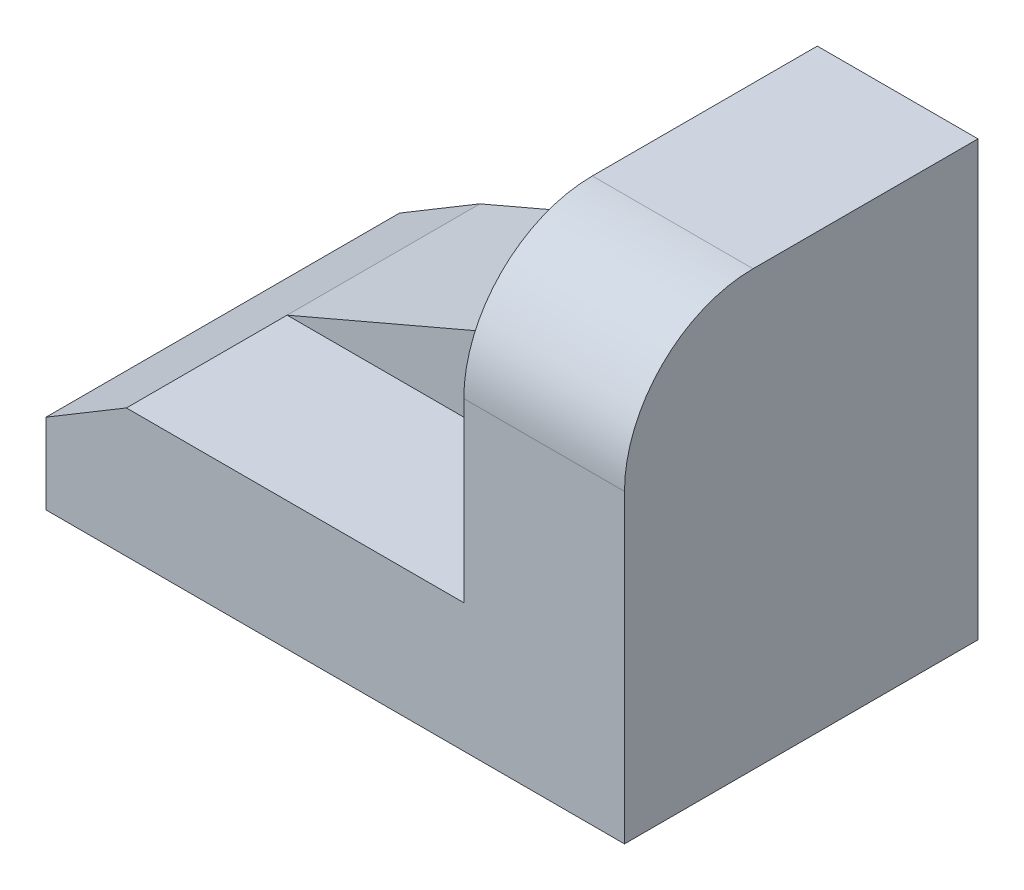
ISO-10303-21;
HEADER;
FILE_DESCRIPTION(('STEP AP214'),'2;1');
FILE_NAME('part.step','',(''),(''),'','','');
FILE_SCHEMA(('AUTOMOTIVE_DESIGN { 1 0 10303 214 1 1 1 1 }'));
ENDSEC;
DATA;
#1=APPLICATION_CONTEXT('core data for automotive mechanical design processes');
#2=APPLICATION_PROTOCOL_DEFINITION('international standard','automotive_design',2000,#1);
#3=PRODUCT_CONTEXT('',#1,'mechanical');
#4=PRODUCT('Part','Part','',(#3));
#5=PRODUCT_RELATED_PRODUCT_CATEGORY('part','',(#4));
#6=PRODUCT_DEFINITION_FORMATION('','',#4);
#7=PRODUCT_DEFINITION_CONTEXT('part definition',#1,'design');
#8=PRODUCT_DEFINITION('design','',#6,#7);
#9=PRODUCT_DEFINITION_SHAPE('','',#8);
#10=(LENGTH_UNIT() NAMED_UNIT(*) SI_UNIT(.MILLI.,.METRE.));
#11=(NAMED_UNIT(*) PLANE_ANGLE_UNIT() SI_UNIT($,.RADIAN.));
#12=(NAMED_UNIT(*) SI_UNIT($,.STERADIAN.) SOLID_ANGLE_UNIT());
#13=UNCERTAINTY_MEASURE_WITH_UNIT(LENGTH_MEASURE(1.E-05),#10,'distance_accuracy_value','');
#14=(GEOMETRIC_REPRESENTATION_CONTEXT(3) GLOBAL_UNCERTAINTY_ASSIGNED_CONTEXT((#13)) GLOBAL_UNIT_ASSIGNED_CONTEXT((#10,
#11,#12)) REPRESENTATION_CONTEXT('',''));
#15=CARTESIAN_POINT('',(0.,0.,0.));
#16=DIRECTION('',(0.,0.,1.));
#17=DIRECTION('',(1.,0.,0.));
#18=AXIS2_PLACEMENT_3D('',#15,#16,#17);
#19=CARTESIAN_POINT('',(5004.22818467735,8000.,22000.));
#20=DIRECTION('',(0.,-1.,0.));
#21=DIRECTION('',(0.,0.,-1.));
#22=AXIS2_PLACEMENT_3D('',#19,#20,#21);
#23=PLANE('',#22);
#24=DIRECTION('',(-1.,0.,0.));
#25=VECTOR('',#24,1.);
#26=CARTESIAN_POINT('',(5004.22818467735,8000.,12000.));
#27=LINE('',#26,#25);
#28=CARTESIAN_POINT('',(26000.,8000.,12000.));
#29=VERTEX_POINT('',#28);
#30=CARTESIAN_POINT('',(5004.22818467735,8000.,12000.));
#31=VERTEX_POINT('',#30);
#32=EDGE_CURVE('E176',#29,#31,#27,.T.);
#33=ORIENTED_EDGE('',*,*,#32,.T.);
#34=DIRECTION('',(0.,0.,-1.));
#35=VECTOR('',#34,1.);
#36=CARTESIAN_POINT('',(5004.22818467735,8000.,22000.));
#37=LINE('',#36,#35);
#38=CARTESIAN_POINT('',(5004.22818467735,8000.,22000.));
#39=VERTEX_POINT('',#38);
#40=EDGE_CURVE('E170',#39,#31,#37,.T.);
#41=ORIENTED_EDGE('',*,*,#40,.F.);
#42=DIRECTION('',(-1.,0.,0.));
#43=VECTOR('',#42,1.);
#44=CARTESIAN_POINT('',(5004.22818467735,8000.,22000.));
#45=LINE('',#44,#43);
#46=CARTESIAN_POINT('',(26000.,8000.,22000.));
#47=VERTEX_POINT('',#46);
#48=EDGE_CURVE('E177',#47,#39,#45,.T.);
#49=ORIENTED_EDGE('',*,*,#48,.F.);
#50=DIRECTION('',(0.,0.,-1.));
#51=VECTOR('',#50,1.);
#52=CARTESIAN_POINT('',(26000.,8000.,22000.));
#53=LINE('',#52,#51);
#54=EDGE_CURVE('E133',#47,#29,#53,.T.);
#55=ORIENTED_EDGE('',*,*,#54,.T.);
#56=EDGE_LOOP('',(#33,#41,#49,#55));
#57=FACE_BOUND('',#56,.T.);
#58=ADVANCED_FACE('F33',(#57),#23,.F.);
#59=CARTESIAN_POINT('',(36000.,27000.,22000.));
#60=DIRECTION('',(0.,-1.,0.));
#61=DIRECTION('',(0.,0.,-1.));
#62=AXIS2_PLACEMENT_3D('',#59,#60,#61);
#63=PLANE('',#62);
#64=DIRECTION('',(1.,0.,0.));
#65=VECTOR('',#64,1.);
#66=CARTESIAN_POINT('',(14000.,27000.,13999.9999999999));
#67=LINE('',#66,#65);
#68=CARTESIAN_POINT('',(26000.,27000.,13999.9999999999));
#69=VERTEX_POINT('',#68);
#70=CARTESIAN_POINT('',(36000.,27000.,13999.9999999999));
#71=VERTEX_POINT('',#70);
#72=EDGE_CURVE('E108',#69,#71,#67,.T.);
#73=ORIENTED_EDGE('',*,*,#72,.T.);
#74=DIRECTION('',(0.,0.,-1.));
#75=VECTOR('',#74,1.);
#76=CARTESIAN_POINT('',(36000.,27000.,22000.));
#77=LINE('',#76,#75);
#78=CARTESIAN_POINT('',(36000.,27000.,0.));
#79=VERTEX_POINT('',#78);
#80=EDGE_CURVE('E120',#71,#79,#77,.T.);
#81=ORIENTED_EDGE('',*,*,#80,.T.);
#82=DIRECTION('',(-1.,0.,0.));
#83=VECTOR('',#82,1.);
#84=CARTESIAN_POINT('',(36000.,27000.,0.));
#85=LINE('',#84,#83);
#86=CARTESIAN_POINT('',(26000.,27000.,0.));
#87=VERTEX_POINT('',#86);
#88=EDGE_CURVE('E162',#79,#87,#85,.T.);
#89=ORIENTED_EDGE('',*,*,#88,.T.);
#90=DIRECTION('',(0.,0.,-1.));
#91=VECTOR('',#90,1.);
#92=CARTESIAN_POINT('',(26000.,27000.,22000.));
#93=LINE('',#92,#91);
#94=EDGE_CURVE('E122',#69,#87,#93,.T.);
#95=ORIENTED_EDGE('',*,*,#94,.F.);
#96=EDGE_LOOP('',(#73,#81,#89,#95));
#97=FACE_BOUND('',#96,.T.);
#98=ADVANCED_FACE('F118',(#97),#63,.F.);
#99=CARTESIAN_POINT('',(0.,0.,22000.));
#100=DIRECTION('',(1.,0.,0.));
#101=DIRECTION('',(0.,0.,-1.));
#102=AXIS2_PLACEMENT_3D('',#99,#100,#101);
#103=PLANE('',#102);
#104=DIRECTION('',(0.,-1.,0.));
#105=VECTOR('',#104,1.);
#106=CARTESIAN_POINT('',(0.,0.,0.));
#107=LINE('',#106,#105);
#108=CARTESIAN_POINT('',(0.,5000.,0.));
#109=VERTEX_POINT('',#108);
#110=CARTESIAN_POINT('',(0.,0.,0.));
#111=VERTEX_POINT('',#110);
#112=EDGE_CURVE('E149',#109,#111,#107,.T.);
#113=ORIENTED_EDGE('',*,*,#112,.T.);
#114=DIRECTION('',(0.,0.,-1.));
#115=VECTOR('',#114,1.);
#116=CARTESIAN_POINT('',(0.,0.,22000.));
#117=LINE('',#116,#115);
#118=CARTESIAN_POINT('',(0.,0.,22000.));
#119=VERTEX_POINT('',#118);
#120=EDGE_CURVE('E41',#119,#111,#117,.T.);
#121=ORIENTED_EDGE('',*,*,#120,.F.);
#122=DIRECTION('',(0.,-1.,0.));
#123=VECTOR('',#122,1.);
#124=CARTESIAN_POINT('',(0.,0.,22000.));
#125=LINE('',#124,#123);
#126=CARTESIAN_POINT('',(0.,5000.,22000.));
#127=VERTEX_POINT('',#126);
#128=EDGE_CURVE('E168',#127,#119,#125,.T.);
#129=ORIENTED_EDGE('',*,*,#128,.F.);
#130=DIRECTION('',(0.,0.,-1.));
#131=VECTOR('',#130,1.);
#132=CARTESIAN_POINT('',(0.,5000.,22000.));
#133=LINE('',#132,#131);
#134=EDGE_CURVE('E151',#127,#109,#133,.T.);
#135=ORIENTED_EDGE('',*,*,#134,.T.);
#136=EDGE_LOOP('',(#113,#121,#129,#135));
#137=FACE_BOUND('',#136,.T.);
#138=ADVANCED_FACE('F35',(#137),#103,.F.);
#139=CARTESIAN_POINT('',(0.,0.,22000.));
#140=DIRECTION('',(0.,1.,0.));
#141=DIRECTION('',(0.,0.,1.));
#142=AXIS2_PLACEMENT_3D('',#139,#140,#141);
#143=PLANE('',#142);
#144=DIRECTION('',(1.,0.,0.));
#145=VECTOR('',#144,1.);
#146=CARTESIAN_POINT('',(0.,0.,0.));
#147=LINE('',#146,#145);
#148=CARTESIAN_POINT('',(36000.,0.,0.));
#149=VERTEX_POINT('',#148);
#150=EDGE_CURVE('E142',#111,#149,#147,.T.);
#151=ORIENTED_EDGE('',*,*,#150,.T.);
#152=DIRECTION('',(0.,0.,-1.));
#153=VECTOR('',#152,1.);
#154=CARTESIAN_POINT('',(36000.,0.,22000.));
#155=LINE('',#154,#153);
#156=CARTESIAN_POINT('',(36000.,0.,22000.));
#157=VERTEX_POINT('',#156);
#158=EDGE_CURVE('E130',#157,#149,#155,.T.);
#159=ORIENTED_EDGE('',*,*,#158,.F.);
#160=DIRECTION('',(1.,0.,0.));
#161=VECTOR('',#160,1.);
#162=CARTESIAN_POINT('',(0.,0.,22000.));
#163=LINE('',#162,#161);
#164=EDGE_CURVE('E143',#119,#157,#163,.T.);
#165=ORIENTED_EDGE('',*,*,#164,.F.);
#166=ORIENTED_EDGE('',*,*,#120,.T.);
#167=EDGE_LOOP('',(#151,#159,#165,#166));
#168=FACE_BOUND('',#167,.T.);
#169=ADVANCED_FACE('F140',(#168),#143,.F.);
#170=CARTESIAN_POINT('',(36000.,0.,22000.));
#171=DIRECTION('',(-1.,0.,0.));
#172=DIRECTION('',(0.,0.,1.));
#173=AXIS2_PLACEMENT_3D('',#170,#171,#172);
#174=PLANE('',#173);
#175=ORIENTED_EDGE('',*,*,#80,.F.);
#176=CARTESIAN_POINT('',(36000.,19000.,14000.));
#177=DIRECTION('',(-1.,0.,0.));
#178=DIRECTION('',(0.,0.,1.));
#179=AXIS2_PLACEMENT_3D('',#176,#177,#178);
#180=CIRCLE('',#179,8000.);
#181=CARTESIAN_POINT('',(36000.,18999.9999999999,22000.));
#182=VERTEX_POINT('',#181);
#183=EDGE_CURVE('E105',#182,#71,#180,.T.);
#184=ORIENTED_EDGE('',*,*,#183,.F.);
#185=DIRECTION('',(0.,1.,0.));
#186=VECTOR('',#185,1.);
#187=CARTESIAN_POINT('',(36000.,0.,22000.));
#188=LINE('',#187,#186);
#189=EDGE_CURVE('E195',#157,#182,#188,.T.);
#190=ORIENTED_EDGE('',*,*,#189,.F.);
#191=ORIENTED_EDGE('',*,*,#158,.T.);
#192=DIRECTION('',(0.,1.,0.));
#193=VECTOR('',#192,1.);
#194=CARTESIAN_POINT('',(36000.,0.,0.));
#195=LINE('',#194,#193);
#196=EDGE_CURVE('E128',#149,#79,#195,.T.);
#197=ORIENTED_EDGE('',*,*,#196,.T.);
#198=EDGE_LOOP('',(#175,#184,#190,#191,#197));
#199=FACE_BOUND('',#198,.T.);
#200=ADVANCED_FACE('F125',(#199),#174,.F.);
#201=CARTESIAN_POINT('',(26000.,27000.,22000.));
#202=DIRECTION('',(1.,0.,0.));
#203=DIRECTION('',(0.,1.,0.));
#204=AXIS2_PLACEMENT_3D('',#201,#202,#203);
#205=PLANE('',#204);
#206=DIRECTION('',(0.,-1.,0.));
#207=VECTOR('',#206,1.);
#208=CARTESIAN_POINT('',(26000.,27000.,0.));
#209=LINE('',#208,#207);
#210=CARTESIAN_POINT('',(26000.,17000.,0.));
#211=VERTEX_POINT('',#210);
#212=EDGE_CURVE('E164',#87,#211,#209,.T.);
#213=ORIENTED_EDGE('',*,*,#212,.T.);
#214=DIRECTION('',(0.,0.,-1.));
#215=VECTOR('',#214,1.);
#216=CARTESIAN_POINT('',(26000.,17000.,12000.));
#217=LINE('',#216,#215);
#218=CARTESIAN_POINT('',(26000.,17000.,12000.));
#219=VERTEX_POINT('',#218);
#220=EDGE_CURVE('E48',#219,#211,#217,.T.);
#221=ORIENTED_EDGE('',*,*,#220,.F.);
#222=DIRECTION('',(0.,-1.,0.));
#223=VECTOR('',#222,1.);
#224=CARTESIAN_POINT('',(26000.,8000.,12000.));
#225=LINE('',#224,#223);
#226=EDGE_CURVE('E52',#219,#29,#225,.T.);
#227=ORIENTED_EDGE('',*,*,#226,.T.);
#228=ORIENTED_EDGE('',*,*,#54,.F.);
#229=DIRECTION('',(0.,-1.,0.));
#230=VECTOR('',#229,1.);
#231=CARTESIAN_POINT('',(26000.,27000.,22000.));
#232=LINE('',#231,#230);
#233=CARTESIAN_POINT('',(26000.,19000.,22000.));
#234=VERTEX_POINT('',#233);
#235=EDGE_CURVE('E197',#234,#47,#232,.T.);
#236=ORIENTED_EDGE('',*,*,#235,.F.);
#237=CARTESIAN_POINT('',(26000.,19000.,14000.));
#238=DIRECTION('',(1.,0.,0.));
#239=DIRECTION('',(0.,1.,0.));
#240=AXIS2_PLACEMENT_3D('',#237,#238,#239);
#241=CIRCLE('',#240,8000.);
#242=EDGE_CURVE('E123',#234,#69,#241,.F.);
#243=ORIENTED_EDGE('',*,*,#242,.T.);
#244=ORIENTED_EDGE('',*,*,#94,.T.);
#245=EDGE_LOOP('',(#213,#221,#227,#228,#236,#243,#244));
#246=FACE_BOUND('',#245,.T.);
#247=ADVANCED_FACE('F226',(#246),#205,.F.);
#248=CARTESIAN_POINT('',(0.,5000.,22000.));
#249=DIRECTION('',(0.514176009207606,-0.857684692387208,0.));
#250=DIRECTION('',(0.857684692387208,0.514176009207606,0.));
#251=AXIS2_PLACEMENT_3D('',#248,#249,#250);
#252=PLANE('',#251);
#253=DIRECTION('',(-0.857684692387208,-0.514176009207606,0.));
#254=VECTOR('',#253,1.);
#255=CARTESIAN_POINT('',(0.,5000.,0.));
#256=LINE('',#255,#254);
#257=CARTESIAN_POINT('',(5004.22818467735,8000.,0.));
#258=VERTEX_POINT('',#257);
#259=EDGE_CURVE('E166',#258,#109,#256,.T.);
#260=ORIENTED_EDGE('',*,*,#259,.T.);
#261=ORIENTED_EDGE('',*,*,#134,.F.);
#262=DIRECTION('',(-0.857684692387208,-0.514176009207606,0.));
#263=VECTOR('',#262,1.);
#264=CARTESIAN_POINT('',(0.,5000.,22000.));
#265=LINE('',#264,#263);
#266=EDGE_CURVE('E158',#39,#127,#265,.T.);
#267=ORIENTED_EDGE('',*,*,#266,.F.);
#268=ORIENTED_EDGE('',*,*,#40,.T.);
#269=DIRECTION('',(0.,0.,-1.));
#270=VECTOR('',#269,1.);
#271=CARTESIAN_POINT('',(5004.22818467735,8000.,12000.));
#272=LINE('',#271,#270);
#273=EDGE_CURVE('E114',#31,#258,#272,.T.);
#274=ORIENTED_EDGE('',*,*,#273,.T.);
#275=EDGE_LOOP('',(#260,#261,#267,#268,#274));
#276=FACE_BOUND('',#275,.T.);
#277=ADVANCED_FACE('F202',(#276),#252,.F.);
#278=CARTESIAN_POINT('',(0.,0.,22000.));
#279=DIRECTION('',(0.,0.,-1.));
#280=DIRECTION('',(-1.,0.,0.));
#281=AXIS2_PLACEMENT_3D('',#278,#279,#280);
#282=PLANE('',#281);
#283=ORIENTED_EDGE('',*,*,#189,.T.);
#284=DIRECTION('',(1.,0.,0.));
#285=VECTOR('',#284,1.);
#286=CARTESIAN_POINT('',(14000.,19000.,22000.));
#287=LINE('',#286,#285);
#288=EDGE_CURVE('E11',#182,#234,#287,.F.);
#289=ORIENTED_EDGE('',*,*,#288,.T.);
#290=ORIENTED_EDGE('',*,*,#235,.T.);
#291=ORIENTED_EDGE('',*,*,#48,.T.);
#292=ORIENTED_EDGE('',*,*,#266,.T.);
#293=ORIENTED_EDGE('',*,*,#128,.T.);
#294=ORIENTED_EDGE('',*,*,#164,.T.);
#295=EDGE_LOOP('',(#283,#289,#290,#291,#292,#293,#294));
#296=FACE_BOUND('',#295,.T.);
#297=ADVANCED_FACE('F200',(#296),#282,.F.);
#298=CARTESIAN_POINT('',(0.,0.,0.));
#299=DIRECTION('',(0.,0.,-1.));
#300=DIRECTION('',(-1.,0.,0.));
#301=AXIS2_PLACEMENT_3D('',#298,#299,#300);
#302=PLANE('',#301);
#303=ORIENTED_EDGE('',*,*,#259,.F.);
#304=DIRECTION('',(0.919116306076656,0.393986314361303,0.));
#305=VECTOR('',#304,1.);
#306=CARTESIAN_POINT('',(26000.,17000.,0.));
#307=LINE('',#306,#305);
#308=EDGE_CURVE('E189',#258,#211,#307,.T.);
#309=ORIENTED_EDGE('',*,*,#308,.T.);
#310=ORIENTED_EDGE('',*,*,#212,.F.);
#311=ORIENTED_EDGE('',*,*,#88,.F.);
#312=ORIENTED_EDGE('',*,*,#196,.F.);
#313=ORIENTED_EDGE('',*,*,#150,.F.);
#314=ORIENTED_EDGE('',*,*,#112,.F.);
#315=EDGE_LOOP('',(#303,#309,#310,#311,#312,#313,#314));
#316=FACE_BOUND('',#315,.T.);
#317=ADVANCED_FACE('F205',(#316),#302,.T.);
#318=CARTESIAN_POINT('',(14000.,19000.,14000.));
#319=DIRECTION('',(1.,0.,0.));
#320=DIRECTION('',(0.,0.,-1.));
#321=AXIS2_PLACEMENT_3D('',#318,#319,#320);
#322=CYLINDRICAL_SURFACE('',#321,8000.);
#323=ORIENTED_EDGE('',*,*,#288,.F.);
#324=ORIENTED_EDGE('',*,*,#183,.T.);
#325=ORIENTED_EDGE('',*,*,#72,.F.);
#326=ORIENTED_EDGE('',*,*,#242,.F.);
#327=EDGE_LOOP('',(#323,#324,#325,#326));
#328=FACE_BOUND('',#327,.T.);
#329=ADVANCED_FACE('F107',(#328),#322,.T.);
#330=CARTESIAN_POINT('',(26000.,17000.,12000.));
#331=DIRECTION('',(-0.393986314361303,0.919116306076656,0.));
#332=DIRECTION('',(-0.919116306076656,-0.393986314361303,0.));
#333=AXIS2_PLACEMENT_3D('',#330,#331,#332);
#334=PLANE('',#333);
#335=ORIENTED_EDGE('',*,*,#308,.F.);
#336=ORIENTED_EDGE('',*,*,#273,.F.);
#337=DIRECTION('',(0.919116306076656,0.393986314361303,0.));
#338=VECTOR('',#337,1.);
#339=CARTESIAN_POINT('',(26000.,17000.,12000.));
#340=LINE('',#339,#338);
#341=EDGE_CURVE('E183',#31,#219,#340,.T.);
#342=ORIENTED_EDGE('',*,*,#341,.T.);
#343=ORIENTED_EDGE('',*,*,#220,.T.);
#344=EDGE_LOOP('',(#335,#336,#342,#343));
#345=FACE_BOUND('',#344,.T.);
#346=ADVANCED_FACE('F208',(#345),#334,.T.);
#347=CARTESIAN_POINT('',(0.,0.,12000.));
#348=DIRECTION('',(0.,0.,-1.));
#349=DIRECTION('',(-1.,0.,0.));
#350=AXIS2_PLACEMENT_3D('',#347,#348,#349);
#351=PLANE('',#350);
#352=ORIENTED_EDGE('',*,*,#341,.F.);
#353=ORIENTED_EDGE('',*,*,#32,.F.);
#354=ORIENTED_EDGE('',*,*,#226,.F.);
#355=EDGE_LOOP('',(#352,#353,#354));
#356=FACE_BOUND('',#355,.T.);
#357=ADVANCED_FACE('F181',(#356),#351,.F.);
#358=CLOSED_SHELL('',(#58,#98,#138,#169,#200,#247,#277,#297,#317,#329,#346,#357));
#359=MANIFOLD_SOLID_BREP('B2',#358);
#360=ADVANCED_BREP_SHAPE_REPRESENTATION('',(#18,#359),#14);
#361=SHAPE_DEFINITION_REPRESENTATION(#9,#360);
ENDSEC;
END-ISO-10303-21;
